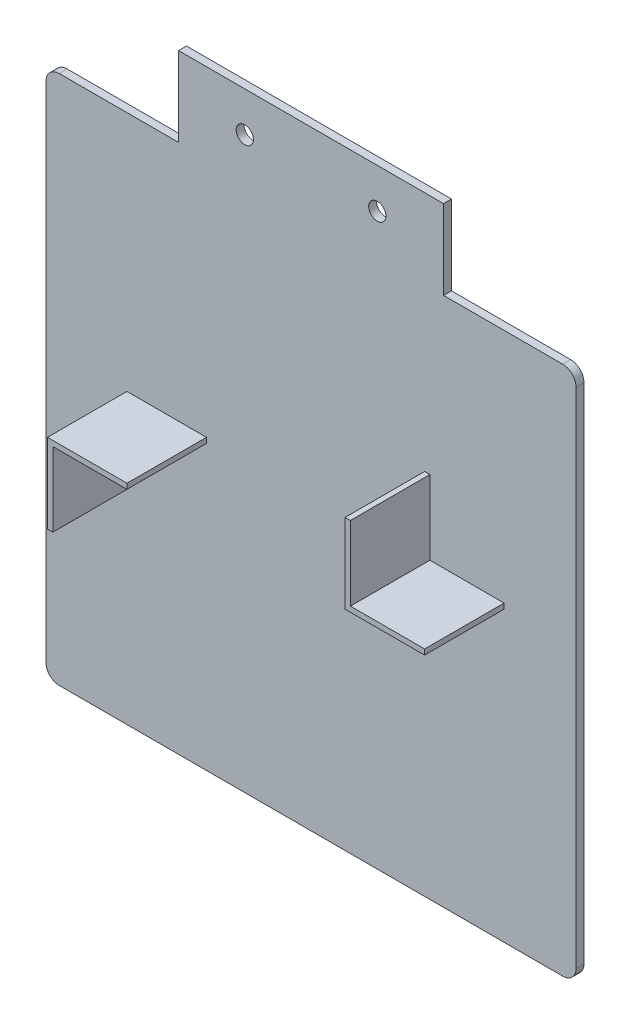
ISO-10303-21;
HEADER;
FILE_DESCRIPTION(('STEP AP214'),'2;1');
FILE_NAME('part.step','',(''),(''),'','','');
FILE_SCHEMA(('AUTOMOTIVE_DESIGN { 1 0 10303 214 1 1 1 1 }'));
ENDSEC;
DATA;
#1=APPLICATION_CONTEXT('core data for automotive mechanical design processes');
#2=APPLICATION_PROTOCOL_DEFINITION('international standard','automotive_design',2000,#1);
#3=PRODUCT_CONTEXT('',#1,'mechanical');
#4=PRODUCT('Part','Part','',(#3));
#5=PRODUCT_RELATED_PRODUCT_CATEGORY('part','',(#4));
#6=PRODUCT_DEFINITION_FORMATION('','',#4);
#7=PRODUCT_DEFINITION_CONTEXT('part definition',#1,'design');
#8=PRODUCT_DEFINITION('design','',#6,#7);
#9=PRODUCT_DEFINITION_SHAPE('','',#8);
#10=(LENGTH_UNIT() NAMED_UNIT(*) SI_UNIT(.MILLI.,.METRE.));
#11=(NAMED_UNIT(*) PLANE_ANGLE_UNIT() SI_UNIT($,.RADIAN.));
#12=(NAMED_UNIT(*) SI_UNIT($,.STERADIAN.) SOLID_ANGLE_UNIT());
#13=UNCERTAINTY_MEASURE_WITH_UNIT(LENGTH_MEASURE(1.E-05),#10,'distance_accuracy_value','');
#14=(GEOMETRIC_REPRESENTATION_CONTEXT(3) GLOBAL_UNCERTAINTY_ASSIGNED_CONTEXT((#13)) GLOBAL_UNIT_ASSIGNED_CONTEXT((#10,
#11,#12)) REPRESENTATION_CONTEXT('',''));
#15=CARTESIAN_POINT('',(0.,0.,0.));
#16=DIRECTION('',(0.,0.,1.));
#17=DIRECTION('',(1.,0.,0.));
#18=AXIS2_PLACEMENT_3D('',#15,#16,#17);
#19=CARTESIAN_POINT('',(-124.91452991453,37.2649572649573,0.));
#20=DIRECTION('',(0.,0.,-1.));
#21=DIRECTION('',(-1.,0.,0.));
#22=AXIS2_PLACEMENT_3D('',#19,#20,#21);
#23=PLANE('',#22);
#24=DIRECTION('',(0.,1.,0.));
#25=VECTOR('',#24,1.);
#26=CARTESIAN_POINT('',(42.9455751494544,-46.8579148870407,0.));
#27=LINE('',#26,#25);
#28=CARTESIAN_POINT('',(42.9455751494544,-48.8579148870407,0.));
#29=VERTEX_POINT('',#28);
#30=CARTESIAN_POINT('',(42.9455751494543,-46.8579148870407,0.));
#31=VERTEX_POINT('',#30);
#32=EDGE_CURVE('E224',#29,#31,#27,.T.);
#33=ORIENTED_EDGE('',*,*,#32,.F.);
#34=DIRECTION('',(1.,0.,0.));
#35=VECTOR('',#34,1.);
#36=CARTESIAN_POINT('',(42.9455751494544,-48.8579148870407,0.));
#37=LINE('',#36,#35);
#38=CARTESIAN_POINT('',(12.9455751494544,-48.8579148870407,0.));
#39=VERTEX_POINT('',#38);
#40=EDGE_CURVE('E237',#39,#29,#37,.T.);
#41=ORIENTED_EDGE('',*,*,#40,.F.);
#42=DIRECTION('',(0.,-1.,0.));
#43=VECTOR('',#42,1.);
#44=CARTESIAN_POINT('',(12.9455751494544,-48.8579148870407,0.));
#45=LINE('',#44,#43);
#46=CARTESIAN_POINT('',(12.9455751494544,-18.8579148870407,0.));
#47=VERTEX_POINT('',#46);
#48=EDGE_CURVE('E256',#47,#39,#45,.T.);
#49=ORIENTED_EDGE('',*,*,#48,.F.);
#50=DIRECTION('',(-1.,0.,0.));
#51=VECTOR('',#50,1.);
#52=CARTESIAN_POINT('',(14.9455751494544,-18.8579148870407,0.));
#53=LINE('',#52,#51);
#54=CARTESIAN_POINT('',(14.9455751494544,-18.8579148870407,0.));
#55=VERTEX_POINT('',#54);
#56=EDGE_CURVE('E253',#55,#47,#53,.T.);
#57=ORIENTED_EDGE('',*,*,#56,.F.);
#58=DIRECTION('',(0.,1.,0.));
#59=VECTOR('',#58,1.);
#60=CARTESIAN_POINT('',(14.9455751494544,-46.8579148870407,0.));
#61=LINE('',#60,#59);
#62=CARTESIAN_POINT('',(14.9455751494544,-46.8579148870407,0.));
#63=VERTEX_POINT('',#62);
#64=EDGE_CURVE('E250',#63,#55,#61,.T.);
#65=ORIENTED_EDGE('',*,*,#64,.F.);
#66=DIRECTION('',(-1.,0.,0.));
#67=VECTOR('',#66,1.);
#68=CARTESIAN_POINT('',(42.9455751494544,-46.8579148870407,0.));
#69=LINE('',#68,#67);
#70=EDGE_CURVE('E227',#31,#63,#69,.T.);
#71=ORIENTED_EDGE('',*,*,#70,.F.);
#72=EDGE_LOOP('',(#33,#41,#49,#57,#65,#71));
#73=FACE_BOUND('',#72,.T.);
#74=CARTESIAN_POINT('',(-54.91452991453,57.2649572649573,0.));
#75=DIRECTION('',(0.,0.,1.));
#76=DIRECTION('',(1.,0.,0.));
#77=AXIS2_PLACEMENT_3D('',#74,#75,#76);
#78=CIRCLE('',#77,3.25);
#79=CARTESIAN_POINT('',(-51.66452991453,57.2649572649573,0.));
#80=VERTEX_POINT('',#79);
#81=EDGE_CURVE('E278',#80,#80,#78,.T.);
#82=ORIENTED_EDGE('',*,*,#81,.F.);
#83=EDGE_LOOP('',(#82));
#84=FACE_BOUND('',#83,.T.);
#85=CARTESIAN_POINT('',(-4.91452991452994,57.2649572649573,0.));
#86=DIRECTION('',(0.,0.,1.));
#87=DIRECTION('',(1.,0.,0.));
#88=AXIS2_PLACEMENT_3D('',#85,#86,#87);
#89=CIRCLE('',#88,3.25);
#90=CARTESIAN_POINT('',(-1.66452991452994,57.2649572649573,0.));
#91=VERTEX_POINT('',#90);
#92=EDGE_CURVE('E282',#91,#91,#89,.T.);
#93=ORIENTED_EDGE('',*,*,#92,.F.);
#94=EDGE_LOOP('',(#93));
#95=FACE_BOUND('',#94,.T.);
#96=DIRECTION('',(-1.,0.,0.));
#97=VECTOR('',#96,1.);
#98=CARTESIAN_POINT('',(20.0854700854701,72.2649572649573,0.));
#99=LINE('',#98,#97);
#100=CARTESIAN_POINT('',(20.0854700854701,72.2649572649573,0.));
#101=VERTEX_POINT('',#100);
#102=CARTESIAN_POINT('',(-79.91452991453,72.2649572649573,0.));
#103=VERTEX_POINT('',#102);
#104=EDGE_CURVE('E288',#101,#103,#99,.T.);
#105=ORIENTED_EDGE('',*,*,#104,.T.);
#106=DIRECTION('',(0.,-1.,0.));
#107=VECTOR('',#106,1.);
#108=CARTESIAN_POINT('',(-79.91452991453,72.2649572649573,0.));
#109=LINE('',#108,#107);
#110=CARTESIAN_POINT('',(-79.91452991453,42.2649572649573,0.));
#111=VERTEX_POINT('',#110);
#112=EDGE_CURVE('E330',#103,#111,#109,.T.);
#113=ORIENTED_EDGE('',*,*,#112,.T.);
#114=DIRECTION('',(-1.,0.,0.));
#115=VECTOR('',#114,1.);
#116=CARTESIAN_POINT('',(-79.91452991453,42.2649572649573,0.));
#117=LINE('',#116,#115);
#118=CARTESIAN_POINT('',(-124.91452991453,42.2649572649573,0.));
#119=VERTEX_POINT('',#118);
#120=EDGE_CURVE('E333',#111,#119,#117,.T.);
#121=ORIENTED_EDGE('',*,*,#120,.T.);
#122=CARTESIAN_POINT('',(-124.91452991453,37.2649572649573,0.));
#123=DIRECTION('',(0.,0.,1.));
#124=DIRECTION('',(-1.,0.,0.));
#125=AXIS2_PLACEMENT_3D('',#122,#123,#124);
#126=CIRCLE('',#125,5.);
#127=CARTESIAN_POINT('',(-129.91452991453,37.2649572649572,0.));
#128=VERTEX_POINT('',#127);
#129=EDGE_CURVE('E336',#119,#128,#126,.T.);
#130=ORIENTED_EDGE('',*,*,#129,.T.);
#131=DIRECTION('',(0.,-1.,0.));
#132=VECTOR('',#131,1.);
#133=CARTESIAN_POINT('',(-129.91452991453,37.2649572649572,0.));
#134=LINE('',#133,#132);
#135=CARTESIAN_POINT('',(-129.91452991453,-152.735042735043,0.));
#136=VERTEX_POINT('',#135);
#137=EDGE_CURVE('E339',#128,#136,#134,.T.);
#138=ORIENTED_EDGE('',*,*,#137,.T.);
#139=CARTESIAN_POINT('',(-124.91452991453,-152.735042735043,0.));
#140=DIRECTION('',(0.,0.,1.));
#141=DIRECTION('',(-1.,0.,0.));
#142=AXIS2_PLACEMENT_3D('',#139,#140,#141);
#143=CIRCLE('',#142,5.);
#144=CARTESIAN_POINT('',(-124.91452991453,-157.735042735043,0.));
#145=VERTEX_POINT('',#144);
#146=EDGE_CURVE('E342',#136,#145,#143,.T.);
#147=ORIENTED_EDGE('',*,*,#146,.T.);
#148=DIRECTION('',(1.,0.,0.));
#149=VECTOR('',#148,1.);
#150=CARTESIAN_POINT('',(65.08547008547,-157.735042735043,0.));
#151=LINE('',#150,#149);
#152=CARTESIAN_POINT('',(65.08547008547,-157.735042735043,0.));
#153=VERTEX_POINT('',#152);
#154=EDGE_CURVE('E345',#145,#153,#151,.T.);
#155=ORIENTED_EDGE('',*,*,#154,.T.);
#156=CARTESIAN_POINT('',(65.08547008547,-152.735042735043,0.));
#157=DIRECTION('',(0.,0.,1.));
#158=DIRECTION('',(1.,0.,0.));
#159=AXIS2_PLACEMENT_3D('',#156,#157,#158);
#160=CIRCLE('',#159,5.);
#161=CARTESIAN_POINT('',(70.0854700854701,-152.735042735043,0.));
#162=VERTEX_POINT('',#161);
#163=EDGE_CURVE('E348',#153,#162,#160,.T.);
#164=ORIENTED_EDGE('',*,*,#163,.T.);
#165=DIRECTION('',(0.,1.,0.));
#166=VECTOR('',#165,1.);
#167=CARTESIAN_POINT('',(70.08547008547,37.2649572649573,0.));
#168=LINE('',#167,#166);
#169=CARTESIAN_POINT('',(70.08547008547,37.2649572649573,0.));
#170=VERTEX_POINT('',#169);
#171=EDGE_CURVE('E351',#162,#170,#168,.T.);
#172=ORIENTED_EDGE('',*,*,#171,.T.);
#173=CARTESIAN_POINT('',(65.08547008547,37.2649572649573,0.));
#174=DIRECTION('',(0.,0.,1.));
#175=DIRECTION('',(1.,0.,0.));
#176=AXIS2_PLACEMENT_3D('',#173,#174,#175);
#177=CIRCLE('',#176,5.);
#178=CARTESIAN_POINT('',(65.08547008547,42.2649572649573,0.));
#179=VERTEX_POINT('',#178);
#180=EDGE_CURVE('E354',#170,#179,#177,.T.);
#181=ORIENTED_EDGE('',*,*,#180,.T.);
#182=DIRECTION('',(-1.,0.,0.));
#183=VECTOR('',#182,1.);
#184=CARTESIAN_POINT('',(20.0854700854701,42.2649572649573,0.));
#185=LINE('',#184,#183);
#186=CARTESIAN_POINT('',(20.0854700854701,42.2649572649573,0.));
#187=VERTEX_POINT('',#186);
#188=EDGE_CURVE('E357',#179,#187,#185,.T.);
#189=ORIENTED_EDGE('',*,*,#188,.T.);
#190=DIRECTION('',(0.,1.,0.));
#191=VECTOR('',#190,1.);
#192=CARTESIAN_POINT('',(20.0854700854701,72.2649572649573,0.));
#193=LINE('',#192,#191);
#194=EDGE_CURVE('E295',#187,#101,#193,.T.);
#195=ORIENTED_EDGE('',*,*,#194,.T.);
#196=EDGE_LOOP('',(#105,#113,#121,#130,#138,#147,#155,#164,#172,#181,#189,#195));
#197=FACE_BOUND('',#196,.T.);
#198=DIRECTION('',(0.,1.,0.));
#199=VECTOR('',#198,1.);
#200=CARTESIAN_POINT('',(-69.3774588113321,-50.8579148870407,0.));
#201=LINE('',#200,#199);
#202=CARTESIAN_POINT('',(-69.3774588113321,-50.8579148870407,0.));
#203=VERTEX_POINT('',#202);
#204=CARTESIAN_POINT('',(-69.3774588113321,-48.8579148870407,0.));
#205=VERTEX_POINT('',#204);
#206=EDGE_CURVE('E223',#203,#205,#201,.T.);
#207=ORIENTED_EDGE('',*,*,#206,.F.);
#208=DIRECTION('',(1.,0.,0.));
#209=VECTOR('',#208,1.);
#210=CARTESIAN_POINT('',(-69.3774588113321,-50.8579148870407,0.));
#211=LINE('',#210,#209);
#212=CARTESIAN_POINT('',(-97.3774588113321,-50.8579148870407,0.));
#213=VERTEX_POINT('',#212);
#214=EDGE_CURVE('E220',#213,#203,#211,.T.);
#215=ORIENTED_EDGE('',*,*,#214,.F.);
#216=DIRECTION('',(0.,1.,0.));
#217=VECTOR('',#216,1.);
#218=CARTESIAN_POINT('',(-97.3774588113321,-50.8579148870407,0.));
#219=LINE('',#218,#217);
#220=CARTESIAN_POINT('',(-97.3774588113321,-78.8579148870407,0.));
#221=VERTEX_POINT('',#220);
#222=EDGE_CURVE('E734',#221,#213,#219,.T.);
#223=ORIENTED_EDGE('',*,*,#222,.F.);
#224=DIRECTION('',(1.,0.,0.));
#225=VECTOR('',#224,1.);
#226=CARTESIAN_POINT('',(-97.3774588113321,-78.8579148870407,0.));
#227=LINE('',#226,#225);
#228=CARTESIAN_POINT('',(-99.3774588113321,-78.8579148870407,0.));
#229=VERTEX_POINT('',#228);
#230=EDGE_CURVE('E749',#229,#221,#227,.T.);
#231=ORIENTED_EDGE('',*,*,#230,.F.);
#232=DIRECTION('',(0.,-1.,0.));
#233=VECTOR('',#232,1.);
#234=CARTESIAN_POINT('',(-99.3774588113321,-48.8579148870407,0.));
#235=LINE('',#234,#233);
#236=CARTESIAN_POINT('',(-99.3774588113321,-48.8579148870407,0.));
#237=VERTEX_POINT('',#236);
#238=EDGE_CURVE('E63',#237,#229,#235,.T.);
#239=ORIENTED_EDGE('',*,*,#238,.F.);
#240=DIRECTION('',(-1.,0.,0.));
#241=VECTOR('',#240,1.);
#242=CARTESIAN_POINT('',(-69.3774588113321,-48.8579148870407,0.));
#243=LINE('',#242,#241);
#244=EDGE_CURVE('E58',#205,#237,#243,.T.);
#245=ORIENTED_EDGE('',*,*,#244,.F.);
#246=EDGE_LOOP('',(#207,#215,#223,#231,#239,#245));
#247=FACE_BOUND('',#246,.T.);
#248=ADVANCED_FACE('F41',(#73,#84,#95,#197,#247),#23,.F.);
#249=CARTESIAN_POINT('',(20.0854700854701,72.2649572649573,-3.));
#250=DIRECTION('',(0.,1.,0.));
#251=DIRECTION('',(-1.,0.,0.));
#252=AXIS2_PLACEMENT_3D('',#249,#250,#251);
#253=PLANE('',#252);
#254=ORIENTED_EDGE('',*,*,#104,.F.);
#255=DIRECTION('',(0.,0.,1.));
#256=VECTOR('',#255,1.);
#257=CARTESIAN_POINT('',(20.0854700854701,72.2649572649573,-3.));
#258=LINE('',#257,#256);
#259=CARTESIAN_POINT('',(20.0854700854701,72.2649572649573,-3.));
#260=VERTEX_POINT('',#259);
#261=EDGE_CURVE('E11',#260,#101,#258,.T.);
#262=ORIENTED_EDGE('',*,*,#261,.F.);
#263=DIRECTION('',(-1.,0.,0.));
#264=VECTOR('',#263,1.);
#265=CARTESIAN_POINT('',(20.0854700854701,72.2649572649573,-3.));
#266=LINE('',#265,#264);
#267=CARTESIAN_POINT('',(-79.91452991453,72.2649572649573,-3.));
#268=VERTEX_POINT('',#267);
#269=EDGE_CURVE('E291',#260,#268,#266,.T.);
#270=ORIENTED_EDGE('',*,*,#269,.T.);
#271=DIRECTION('',(0.,0.,1.));
#272=VECTOR('',#271,1.);
#273=CARTESIAN_POINT('',(-79.91452991453,72.2649572649573,-3.));
#274=LINE('',#273,#272);
#275=EDGE_CURVE('E45',#268,#103,#274,.T.);
#276=ORIENTED_EDGE('',*,*,#275,.T.);
#277=EDGE_LOOP('',(#254,#262,#270,#276));
#278=FACE_BOUND('',#277,.T.);
#279=ADVANCED_FACE('F43',(#278),#253,.T.);
#280=CARTESIAN_POINT('',(20.0854700854701,72.2649572649573,-3.));
#281=DIRECTION('',(1.,0.,0.));
#282=DIRECTION('',(0.,1.,0.));
#283=AXIS2_PLACEMENT_3D('',#280,#281,#282);
#284=PLANE('',#283);
#285=ORIENTED_EDGE('',*,*,#194,.F.);
#286=DIRECTION('',(0.,0.,1.));
#287=VECTOR('',#286,1.);
#288=CARTESIAN_POINT('',(20.0854700854701,42.2649572649573,-3.));
#289=LINE('',#288,#287);
#290=CARTESIAN_POINT('',(20.0854700854701,42.2649572649573,-3.));
#291=VERTEX_POINT('',#290);
#292=EDGE_CURVE('E50',#291,#187,#289,.T.);
#293=ORIENTED_EDGE('',*,*,#292,.F.);
#294=DIRECTION('',(0.,1.,0.));
#295=VECTOR('',#294,1.);
#296=CARTESIAN_POINT('',(20.0854700854701,72.2649572649573,-3.));
#297=LINE('',#296,#295);
#298=EDGE_CURVE('E325',#291,#260,#297,.T.);
#299=ORIENTED_EDGE('',*,*,#298,.T.);
#300=ORIENTED_EDGE('',*,*,#261,.T.);
#301=EDGE_LOOP('',(#285,#293,#299,#300));
#302=FACE_BOUND('',#301,.T.);
#303=ADVANCED_FACE('F391',(#302),#284,.T.);
#304=CARTESIAN_POINT('',(20.0854700854701,42.2649572649573,-3.));
#305=DIRECTION('',(0.,1.,0.));
#306=DIRECTION('',(0.,0.,1.));
#307=AXIS2_PLACEMENT_3D('',#304,#305,#306);
#308=PLANE('',#307);
#309=ORIENTED_EDGE('',*,*,#188,.F.);
#310=DIRECTION('',(0.,0.,1.));
#311=VECTOR('',#310,1.);
#312=CARTESIAN_POINT('',(65.08547008547,42.2649572649573,-3.));
#313=LINE('',#312,#311);
#314=CARTESIAN_POINT('',(65.08547008547,42.2649572649573,-3.));
#315=VERTEX_POINT('',#314);
#316=EDGE_CURVE('E363',#315,#179,#313,.T.);
#317=ORIENTED_EDGE('',*,*,#316,.F.);
#318=DIRECTION('',(-1.,0.,0.));
#319=VECTOR('',#318,1.);
#320=CARTESIAN_POINT('',(20.0854700854701,42.2649572649573,-3.));
#321=LINE('',#320,#319);
#322=EDGE_CURVE('E322',#315,#291,#321,.T.);
#323=ORIENTED_EDGE('',*,*,#322,.T.);
#324=ORIENTED_EDGE('',*,*,#292,.T.);
#325=EDGE_LOOP('',(#309,#317,#323,#324));
#326=FACE_BOUND('',#325,.T.);
#327=ADVANCED_FACE('F428',(#326),#308,.T.);
#328=CARTESIAN_POINT('',(65.08547008547,37.2649572649573,-3.));
#329=DIRECTION('',(0.,0.,1.));
#330=DIRECTION('',(1.,0.,0.));
#331=AXIS2_PLACEMENT_3D('',#328,#329,#330);
#332=CYLINDRICAL_SURFACE('',#331,5.);
#333=ORIENTED_EDGE('',*,*,#180,.F.);
#334=DIRECTION('',(0.,0.,1.));
#335=VECTOR('',#334,1.);
#336=CARTESIAN_POINT('',(70.08547008547,37.2649572649573,-3.));
#337=LINE('',#336,#335);
#338=CARTESIAN_POINT('',(70.08547008547,37.2649572649573,-3.));
#339=VERTEX_POINT('',#338);
#340=EDGE_CURVE('E365',#339,#170,#337,.T.);
#341=ORIENTED_EDGE('',*,*,#340,.F.);
#342=CARTESIAN_POINT('',(65.08547008547,37.2649572649573,-3.));
#343=DIRECTION('',(0.,0.,1.));
#344=DIRECTION('',(1.,0.,0.));
#345=AXIS2_PLACEMENT_3D('',#342,#343,#344);
#346=CIRCLE('',#345,5.);
#347=EDGE_CURVE('E319',#339,#315,#346,.T.);
#348=ORIENTED_EDGE('',*,*,#347,.T.);
#349=ORIENTED_EDGE('',*,*,#316,.T.);
#350=EDGE_LOOP('',(#333,#341,#348,#349));
#351=FACE_BOUND('',#350,.T.);
#352=ADVANCED_FACE('F425',(#351),#332,.T.);
#353=CARTESIAN_POINT('',(70.08547008547,37.2649572649573,-3.));
#354=DIRECTION('',(1.,0.,0.));
#355=DIRECTION('',(0.,1.,0.));
#356=AXIS2_PLACEMENT_3D('',#353,#354,#355);
#357=PLANE('',#356);
#358=ORIENTED_EDGE('',*,*,#171,.F.);
#359=DIRECTION('',(0.,0.,1.));
#360=VECTOR('',#359,1.);
#361=CARTESIAN_POINT('',(70.0854700854701,-152.735042735043,-3.));
#362=LINE('',#361,#360);
#363=CARTESIAN_POINT('',(70.0854700854701,-152.735042735043,-3.));
#364=VERTEX_POINT('',#363);
#365=EDGE_CURVE('E367',#364,#162,#362,.T.);
#366=ORIENTED_EDGE('',*,*,#365,.F.);
#367=DIRECTION('',(0.,1.,0.));
#368=VECTOR('',#367,1.);
#369=CARTESIAN_POINT('',(70.08547008547,37.2649572649573,-3.));
#370=LINE('',#369,#368);
#371=EDGE_CURVE('E316',#364,#339,#370,.T.);
#372=ORIENTED_EDGE('',*,*,#371,.T.);
#373=ORIENTED_EDGE('',*,*,#340,.T.);
#374=EDGE_LOOP('',(#358,#366,#372,#373));
#375=FACE_BOUND('',#374,.T.);
#376=ADVANCED_FACE('F422',(#375),#357,.T.);
#377=CARTESIAN_POINT('',(65.08547008547,-152.735042735043,-3.));
#378=DIRECTION('',(0.,0.,1.));
#379=DIRECTION('',(1.,0.,0.));
#380=AXIS2_PLACEMENT_3D('',#377,#378,#379);
#381=CYLINDRICAL_SURFACE('',#380,5.);
#382=ORIENTED_EDGE('',*,*,#163,.F.);
#383=DIRECTION('',(0.,0.,1.));
#384=VECTOR('',#383,1.);
#385=CARTESIAN_POINT('',(65.08547008547,-157.735042735043,-3.));
#386=LINE('',#385,#384);
#387=CARTESIAN_POINT('',(65.08547008547,-157.735042735043,-3.));
#388=VERTEX_POINT('',#387);
#389=EDGE_CURVE('E369',#388,#153,#386,.T.);
#390=ORIENTED_EDGE('',*,*,#389,.F.);
#391=CARTESIAN_POINT('',(65.08547008547,-152.735042735043,-3.));
#392=DIRECTION('',(0.,0.,1.));
#393=DIRECTION('',(1.,0.,0.));
#394=AXIS2_PLACEMENT_3D('',#391,#392,#393);
#395=CIRCLE('',#394,5.);
#396=EDGE_CURVE('E313',#388,#364,#395,.T.);
#397=ORIENTED_EDGE('',*,*,#396,.T.);
#398=ORIENTED_EDGE('',*,*,#365,.T.);
#399=EDGE_LOOP('',(#382,#390,#397,#398));
#400=FACE_BOUND('',#399,.T.);
#401=ADVANCED_FACE('F418',(#400),#381,.T.);
#402=CARTESIAN_POINT('',(65.08547008547,-157.735042735043,-3.));
#403=DIRECTION('',(0.,-1.,0.));
#404=DIRECTION('',(1.,0.,0.));
#405=AXIS2_PLACEMENT_3D('',#402,#403,#404);
#406=PLANE('',#405);
#407=ORIENTED_EDGE('',*,*,#154,.F.);
#408=DIRECTION('',(0.,0.,1.));
#409=VECTOR('',#408,1.);
#410=CARTESIAN_POINT('',(-124.91452991453,-157.735042735043,-3.));
#411=LINE('',#410,#409);
#412=CARTESIAN_POINT('',(-124.91452991453,-157.735042735043,-3.));
#413=VERTEX_POINT('',#412);
#414=EDGE_CURVE('E371',#413,#145,#411,.T.);
#415=ORIENTED_EDGE('',*,*,#414,.F.);
#416=DIRECTION('',(1.,0.,0.));
#417=VECTOR('',#416,1.);
#418=CARTESIAN_POINT('',(65.08547008547,-157.735042735043,-3.));
#419=LINE('',#418,#417);
#420=EDGE_CURVE('E310',#413,#388,#419,.T.);
#421=ORIENTED_EDGE('',*,*,#420,.T.);
#422=ORIENTED_EDGE('',*,*,#389,.T.);
#423=EDGE_LOOP('',(#407,#415,#421,#422));
#424=FACE_BOUND('',#423,.T.);
#425=ADVANCED_FACE('F414',(#424),#406,.T.);
#426=CARTESIAN_POINT('',(-124.91452991453,-152.735042735043,-3.));
#427=DIRECTION('',(0.,0.,1.));
#428=DIRECTION('',(1.,0.,0.));
#429=AXIS2_PLACEMENT_3D('',#426,#427,#428);
#430=CYLINDRICAL_SURFACE('',#429,5.);
#431=ORIENTED_EDGE('',*,*,#146,.F.);
#432=DIRECTION('',(0.,0.,1.));
#433=VECTOR('',#432,1.);
#434=CARTESIAN_POINT('',(-129.91452991453,-152.735042735043,-3.));
#435=LINE('',#434,#433);
#436=CARTESIAN_POINT('',(-129.91452991453,-152.735042735043,-3.));
#437=VERTEX_POINT('',#436);
#438=EDGE_CURVE('E373',#437,#136,#435,.T.);
#439=ORIENTED_EDGE('',*,*,#438,.F.);
#440=CARTESIAN_POINT('',(-124.91452991453,-152.735042735043,-3.));
#441=DIRECTION('',(0.,0.,1.));
#442=DIRECTION('',(-1.,0.,0.));
#443=AXIS2_PLACEMENT_3D('',#440,#441,#442);
#444=CIRCLE('',#443,5.);
#445=EDGE_CURVE('E307',#437,#413,#444,.T.);
#446=ORIENTED_EDGE('',*,*,#445,.T.);
#447=ORIENTED_EDGE('',*,*,#414,.T.);
#448=EDGE_LOOP('',(#431,#439,#446,#447));
#449=FACE_BOUND('',#448,.T.);
#450=ADVANCED_FACE('F410',(#449),#430,.T.);
#451=CARTESIAN_POINT('',(-129.91452991453,37.2649572649572,-3.));
#452=DIRECTION('',(-1.,0.,0.));
#453=DIRECTION('',(0.,-1.,0.));
#454=AXIS2_PLACEMENT_3D('',#451,#452,#453);
#455=PLANE('',#454);
#456=ORIENTED_EDGE('',*,*,#137,.F.);
#457=DIRECTION('',(0.,0.,1.));
#458=VECTOR('',#457,1.);
#459=CARTESIAN_POINT('',(-129.91452991453,37.2649572649572,-3.));
#460=LINE('',#459,#458);
#461=CARTESIAN_POINT('',(-129.91452991453,37.2649572649572,-3.));
#462=VERTEX_POINT('',#461);
#463=EDGE_CURVE('E375',#462,#128,#460,.T.);
#464=ORIENTED_EDGE('',*,*,#463,.F.);
#465=DIRECTION('',(0.,-1.,0.));
#466=VECTOR('',#465,1.);
#467=CARTESIAN_POINT('',(-129.91452991453,37.2649572649572,-3.));
#468=LINE('',#467,#466);
#469=EDGE_CURVE('E304',#462,#437,#468,.T.);
#470=ORIENTED_EDGE('',*,*,#469,.T.);
#471=ORIENTED_EDGE('',*,*,#438,.T.);
#472=EDGE_LOOP('',(#456,#464,#470,#471));
#473=FACE_BOUND('',#472,.T.);
#474=ADVANCED_FACE('F406',(#473),#455,.T.);
#475=CARTESIAN_POINT('',(-124.91452991453,37.2649572649573,-3.));
#476=DIRECTION('',(0.,0.,1.));
#477=DIRECTION('',(1.,0.,0.));
#478=AXIS2_PLACEMENT_3D('',#475,#476,#477);
#479=CYLINDRICAL_SURFACE('',#478,5.);
#480=ORIENTED_EDGE('',*,*,#129,.F.);
#481=DIRECTION('',(0.,0.,1.));
#482=VECTOR('',#481,1.);
#483=CARTESIAN_POINT('',(-124.91452991453,42.2649572649573,-3.));
#484=LINE('',#483,#482);
#485=CARTESIAN_POINT('',(-124.91452991453,42.2649572649573,-3.));
#486=VERTEX_POINT('',#485);
#487=EDGE_CURVE('E377',#486,#119,#484,.T.);
#488=ORIENTED_EDGE('',*,*,#487,.F.);
#489=CARTESIAN_POINT('',(-124.91452991453,37.2649572649573,-3.));
#490=DIRECTION('',(0.,0.,1.));
#491=DIRECTION('',(-1.,0.,0.));
#492=AXIS2_PLACEMENT_3D('',#489,#490,#491);
#493=CIRCLE('',#492,5.);
#494=EDGE_CURVE('E301',#486,#462,#493,.T.);
#495=ORIENTED_EDGE('',*,*,#494,.T.);
#496=ORIENTED_EDGE('',*,*,#463,.T.);
#497=EDGE_LOOP('',(#480,#488,#495,#496));
#498=FACE_BOUND('',#497,.T.);
#499=ADVANCED_FACE('F404',(#498),#479,.T.);
#500=CARTESIAN_POINT('',(-79.91452991453,42.2649572649573,-3.));
#501=DIRECTION('',(0.,1.,0.));
#502=DIRECTION('',(-1.,0.,0.));
#503=AXIS2_PLACEMENT_3D('',#500,#501,#502);
#504=PLANE('',#503);
#505=ORIENTED_EDGE('',*,*,#120,.F.);
#506=DIRECTION('',(0.,0.,1.));
#507=VECTOR('',#506,1.);
#508=CARTESIAN_POINT('',(-79.91452991453,42.2649572649573,-3.));
#509=LINE('',#508,#507);
#510=CARTESIAN_POINT('',(-79.91452991453,42.2649572649573,-3.));
#511=VERTEX_POINT('',#510);
#512=EDGE_CURVE('E378',#511,#111,#509,.T.);
#513=ORIENTED_EDGE('',*,*,#512,.F.);
#514=DIRECTION('',(-1.,0.,0.));
#515=VECTOR('',#514,1.);
#516=CARTESIAN_POINT('',(-79.91452991453,42.2649572649573,-3.));
#517=LINE('',#516,#515);
#518=EDGE_CURVE('E298',#511,#486,#517,.T.);
#519=ORIENTED_EDGE('',*,*,#518,.T.);
#520=ORIENTED_EDGE('',*,*,#487,.T.);
#521=EDGE_LOOP('',(#505,#513,#519,#520));
#522=FACE_BOUND('',#521,.T.);
#523=ADVANCED_FACE('F400',(#522),#504,.T.);
#524=CARTESIAN_POINT('',(-79.91452991453,72.2649572649573,-3.));
#525=DIRECTION('',(-1.,0.,0.));
#526=DIRECTION('',(0.,0.,1.));
#527=AXIS2_PLACEMENT_3D('',#524,#525,#526);
#528=PLANE('',#527);
#529=ORIENTED_EDGE('',*,*,#112,.F.);
#530=ORIENTED_EDGE('',*,*,#275,.F.);
#531=DIRECTION('',(0.,-1.,0.));
#532=VECTOR('',#531,1.);
#533=CARTESIAN_POINT('',(-79.91452991453,72.2649572649573,-3.));
#534=LINE('',#533,#532);
#535=EDGE_CURVE('E294',#268,#511,#534,.T.);
#536=ORIENTED_EDGE('',*,*,#535,.T.);
#537=ORIENTED_EDGE('',*,*,#512,.T.);
#538=EDGE_LOOP('',(#529,#530,#536,#537));
#539=FACE_BOUND('',#538,.T.);
#540=ADVANCED_FACE('F386',(#539),#528,.T.);
#541=CARTESIAN_POINT('',(-124.91452991453,37.2649572649573,-3.));
#542=DIRECTION('',(0.,0.,-1.));
#543=DIRECTION('',(-1.,0.,0.));
#544=AXIS2_PLACEMENT_3D('',#541,#542,#543);
#545=PLANE('',#544);
#546=CARTESIAN_POINT('',(-54.91452991453,57.2649572649573,-3.));
#547=DIRECTION('',(0.,0.,1.));
#548=DIRECTION('',(1.,0.,0.));
#549=AXIS2_PLACEMENT_3D('',#546,#547,#548);
#550=CIRCLE('',#549,3.25);
#551=CARTESIAN_POINT('',(-51.66452991453,57.2649572649573,-3.));
#552=VERTEX_POINT('',#551);
#553=EDGE_CURVE('E279',#552,#552,#550,.T.);
#554=ORIENTED_EDGE('',*,*,#553,.T.);
#555=EDGE_LOOP('',(#554));
#556=FACE_BOUND('',#555,.T.);
#557=CARTESIAN_POINT('',(-4.91452991452994,57.2649572649573,-3.));
#558=DIRECTION('',(0.,0.,1.));
#559=DIRECTION('',(1.,0.,0.));
#560=AXIS2_PLACEMENT_3D('',#557,#558,#559);
#561=CIRCLE('',#560,3.25);
#562=CARTESIAN_POINT('',(-1.66452991452994,57.2649572649573,-3.));
#563=VERTEX_POINT('',#562);
#564=EDGE_CURVE('E285',#563,#563,#561,.T.);
#565=ORIENTED_EDGE('',*,*,#564,.T.);
#566=EDGE_LOOP('',(#565));
#567=FACE_BOUND('',#566,.T.);
#568=ORIENTED_EDGE('',*,*,#269,.F.);
#569=ORIENTED_EDGE('',*,*,#298,.F.);
#570=ORIENTED_EDGE('',*,*,#322,.F.);
#571=ORIENTED_EDGE('',*,*,#347,.F.);
#572=ORIENTED_EDGE('',*,*,#371,.F.);
#573=ORIENTED_EDGE('',*,*,#396,.F.);
#574=ORIENTED_EDGE('',*,*,#420,.F.);
#575=ORIENTED_EDGE('',*,*,#445,.F.);
#576=ORIENTED_EDGE('',*,*,#469,.F.);
#577=ORIENTED_EDGE('',*,*,#494,.F.);
#578=ORIENTED_EDGE('',*,*,#518,.F.);
#579=ORIENTED_EDGE('',*,*,#535,.F.);
#580=EDGE_LOOP('',(#568,#569,#570,#571,#572,#573,#574,#575,#576,#577,#578,#579));
#581=FACE_BOUND('',#580,.T.);
#582=ADVANCED_FACE('F394',(#556,#567,#581),#545,.T.);
#583=CARTESIAN_POINT('',(-4.91452991452994,57.2649572649573,-3.));
#584=DIRECTION('',(0.,0.,1.));
#585=DIRECTION('',(1.,0.,0.));
#586=AXIS2_PLACEMENT_3D('',#583,#584,#585);
#587=CYLINDRICAL_SURFACE('',#586,3.25);
#588=ORIENTED_EDGE('',*,*,#564,.F.);
#589=EDGE_LOOP('',(#588));
#590=FACE_BOUND('',#589,.T.);
#591=ORIENTED_EDGE('',*,*,#92,.T.);
#592=EDGE_LOOP('',(#591));
#593=FACE_BOUND('',#592,.T.);
#594=ADVANCED_FACE('F449',(#590,#593),#587,.F.);
#595=CARTESIAN_POINT('',(-54.91452991453,57.2649572649573,-3.));
#596=DIRECTION('',(0.,0.,1.));
#597=DIRECTION('',(1.,0.,0.));
#598=AXIS2_PLACEMENT_3D('',#595,#596,#597);
#599=CYLINDRICAL_SURFACE('',#598,3.25);
#600=ORIENTED_EDGE('',*,*,#553,.F.);
#601=EDGE_LOOP('',(#600));
#602=FACE_BOUND('',#601,.T.);
#603=ORIENTED_EDGE('',*,*,#81,.T.);
#604=EDGE_LOOP('',(#603));
#605=FACE_BOUND('',#604,.T.);
#606=ADVANCED_FACE('F453',(#602,#605),#599,.F.);
#607=CARTESIAN_POINT('',(42.9455751494544,-46.8579148870407,30.));
#608=DIRECTION('',(-1.,0.,0.));
#609=DIRECTION('',(0.,0.,1.));
#610=AXIS2_PLACEMENT_3D('',#607,#608,#609);
#611=PLANE('',#610);
#612=ORIENTED_EDGE('',*,*,#32,.T.);
#613=DIRECTION('',(0.,0.,-1.));
#614=VECTOR('',#613,1.);
#615=CARTESIAN_POINT('',(42.9455751494544,-46.8579148870407,30.));
#616=LINE('',#615,#614);
#617=CARTESIAN_POINT('',(42.9455751494544,-46.8579148870407,30.));
#618=VERTEX_POINT('',#617);
#619=EDGE_CURVE('E275',#618,#31,#616,.T.);
#620=ORIENTED_EDGE('',*,*,#619,.F.);
#621=DIRECTION('',(0.,1.,0.));
#622=VECTOR('',#621,1.);
#623=CARTESIAN_POINT('',(42.9455751494544,-46.8579148870407,30.));
#624=LINE('',#623,#622);
#625=CARTESIAN_POINT('',(42.9455751494544,-48.8579148870407,30.));
#626=VERTEX_POINT('',#625);
#627=EDGE_CURVE('E233',#626,#618,#624,.T.);
#628=ORIENTED_EDGE('',*,*,#627,.F.);
#629=DIRECTION('',(0.,0.,-1.));
#630=VECTOR('',#629,1.);
#631=CARTESIAN_POINT('',(42.9455751494544,-48.8579148870407,30.));
#632=LINE('',#631,#630);
#633=EDGE_CURVE('E246',#626,#29,#632,.T.);
#634=ORIENTED_EDGE('',*,*,#633,.T.);
#635=EDGE_LOOP('',(#612,#620,#628,#634));
#636=FACE_BOUND('',#635,.T.);
#637=ADVANCED_FACE('F457',(#636),#611,.F.);
#638=CARTESIAN_POINT('',(42.9455751494544,-46.8579148870407,30.));
#639=DIRECTION('',(0.,-1.,0.));
#640=DIRECTION('',(0.,0.,-1.));
#641=AXIS2_PLACEMENT_3D('',#638,#639,#640);
#642=PLANE('',#641);
#643=ORIENTED_EDGE('',*,*,#70,.T.);
#644=DIRECTION('',(0.,0.,-1.));
#645=VECTOR('',#644,1.);
#646=CARTESIAN_POINT('',(14.9455751494544,-46.8579148870407,30.));
#647=LINE('',#646,#645);
#648=CARTESIAN_POINT('',(14.9455751494544,-46.8579148870407,30.));
#649=VERTEX_POINT('',#648);
#650=EDGE_CURVE('E272',#649,#63,#647,.T.);
#651=ORIENTED_EDGE('',*,*,#650,.F.);
#652=DIRECTION('',(-1.,0.,0.));
#653=VECTOR('',#652,1.);
#654=CARTESIAN_POINT('',(42.9455751494544,-46.8579148870407,30.));
#655=LINE('',#654,#653);
#656=EDGE_CURVE('E236',#618,#649,#655,.T.);
#657=ORIENTED_EDGE('',*,*,#656,.F.);
#658=ORIENTED_EDGE('',*,*,#619,.T.);
#659=EDGE_LOOP('',(#643,#651,#657,#658));
#660=FACE_BOUND('',#659,.T.);
#661=ADVANCED_FACE('F461',(#660),#642,.F.);
#662=CARTESIAN_POINT('',(14.9455751494544,-46.8579148870407,30.));
#663=DIRECTION('',(-1.,0.,0.));
#664=DIRECTION('',(0.,0.,1.));
#665=AXIS2_PLACEMENT_3D('',#662,#663,#664);
#666=PLANE('',#665);
#667=ORIENTED_EDGE('',*,*,#64,.T.);
#668=DIRECTION('',(0.,0.,-1.));
#669=VECTOR('',#668,1.);
#670=CARTESIAN_POINT('',(14.9455751494544,-18.8579148870407,30.));
#671=LINE('',#670,#669);
#672=CARTESIAN_POINT('',(14.9455751494544,-18.8579148870407,30.));
#673=VERTEX_POINT('',#672);
#674=EDGE_CURVE('E269',#673,#55,#671,.T.);
#675=ORIENTED_EDGE('',*,*,#674,.F.);
#676=DIRECTION('',(0.,1.,0.));
#677=VECTOR('',#676,1.);
#678=CARTESIAN_POINT('',(14.9455751494544,-46.8579148870407,30.));
#679=LINE('',#678,#677);
#680=EDGE_CURVE('E239',#649,#673,#679,.T.);
#681=ORIENTED_EDGE('',*,*,#680,.F.);
#682=ORIENTED_EDGE('',*,*,#650,.T.);
#683=EDGE_LOOP('',(#667,#675,#681,#682));
#684=FACE_BOUND('',#683,.T.);
#685=ADVANCED_FACE('F465',(#684),#666,.F.);
#686=CARTESIAN_POINT('',(14.9455751494544,-18.8579148870407,30.));
#687=DIRECTION('',(0.,-1.,0.));
#688=DIRECTION('',(0.,0.,-1.));
#689=AXIS2_PLACEMENT_3D('',#686,#687,#688);
#690=PLANE('',#689);
#691=ORIENTED_EDGE('',*,*,#56,.T.);
#692=DIRECTION('',(0.,0.,-1.));
#693=VECTOR('',#692,1.);
#694=CARTESIAN_POINT('',(12.9455751494544,-18.8579148870407,30.));
#695=LINE('',#694,#693);
#696=CARTESIAN_POINT('',(12.9455751494544,-18.8579148870407,30.));
#697=VERTEX_POINT('',#696);
#698=EDGE_CURVE('E266',#697,#47,#695,.T.);
#699=ORIENTED_EDGE('',*,*,#698,.F.);
#700=DIRECTION('',(-1.,0.,0.));
#701=VECTOR('',#700,1.);
#702=CARTESIAN_POINT('',(14.9455751494544,-18.8579148870407,30.));
#703=LINE('',#702,#701);
#704=EDGE_CURVE('E241',#673,#697,#703,.T.);
#705=ORIENTED_EDGE('',*,*,#704,.F.);
#706=ORIENTED_EDGE('',*,*,#674,.T.);
#707=EDGE_LOOP('',(#691,#699,#705,#706));
#708=FACE_BOUND('',#707,.T.);
#709=ADVANCED_FACE('F469',(#708),#690,.F.);
#710=CARTESIAN_POINT('',(12.9455751494544,-48.8579148870407,30.));
#711=DIRECTION('',(1.,0.,0.));
#712=DIRECTION('',(0.,0.,-1.));
#713=AXIS2_PLACEMENT_3D('',#710,#711,#712);
#714=PLANE('',#713);
#715=ORIENTED_EDGE('',*,*,#48,.T.);
#716=DIRECTION('',(0.,0.,-1.));
#717=VECTOR('',#716,1.);
#718=CARTESIAN_POINT('',(12.9455751494544,-48.8579148870407,30.));
#719=LINE('',#718,#717);
#720=CARTESIAN_POINT('',(12.9455751494544,-48.8579148870407,30.));
#721=VERTEX_POINT('',#720);
#722=EDGE_CURVE('E263',#721,#39,#719,.T.);
#723=ORIENTED_EDGE('',*,*,#722,.F.);
#724=DIRECTION('',(0.,-1.,0.));
#725=VECTOR('',#724,1.);
#726=CARTESIAN_POINT('',(12.9455751494544,-48.8579148870407,30.));
#727=LINE('',#726,#725);
#728=EDGE_CURVE('E243',#697,#721,#727,.T.);
#729=ORIENTED_EDGE('',*,*,#728,.F.);
#730=ORIENTED_EDGE('',*,*,#698,.T.);
#731=EDGE_LOOP('',(#715,#723,#729,#730));
#732=FACE_BOUND('',#731,.T.);
#733=ADVANCED_FACE('F473',(#732),#714,.F.);
#734=CARTESIAN_POINT('',(42.9455751494544,-48.8579148870407,30.));
#735=DIRECTION('',(0.,1.,0.));
#736=DIRECTION('',(-1.,0.,0.));
#737=AXIS2_PLACEMENT_3D('',#734,#735,#736);
#738=PLANE('',#737);
#739=ORIENTED_EDGE('',*,*,#40,.T.);
#740=ORIENTED_EDGE('',*,*,#633,.F.);
#741=DIRECTION('',(1.,0.,0.));
#742=VECTOR('',#741,1.);
#743=CARTESIAN_POINT('',(42.9455751494544,-48.8579148870407,30.));
#744=LINE('',#743,#742);
#745=EDGE_CURVE('E245',#721,#626,#744,.T.);
#746=ORIENTED_EDGE('',*,*,#745,.F.);
#747=ORIENTED_EDGE('',*,*,#722,.T.);
#748=EDGE_LOOP('',(#739,#740,#746,#747));
#749=FACE_BOUND('',#748,.T.);
#750=ADVANCED_FACE('F477',(#749),#738,.F.);
#751=CARTESIAN_POINT('',(0.,0.,30.));
#752=DIRECTION('',(0.,0.,-1.));
#753=DIRECTION('',(-1.,0.,0.));
#754=AXIS2_PLACEMENT_3D('',#751,#752,#753);
#755=PLANE('',#754);
#756=ORIENTED_EDGE('',*,*,#627,.T.);
#757=ORIENTED_EDGE('',*,*,#656,.T.);
#758=ORIENTED_EDGE('',*,*,#680,.T.);
#759=ORIENTED_EDGE('',*,*,#704,.T.);
#760=ORIENTED_EDGE('',*,*,#728,.T.);
#761=ORIENTED_EDGE('',*,*,#745,.T.);
#762=EDGE_LOOP('',(#756,#757,#758,#759,#760,#761));
#763=FACE_BOUND('',#762,.T.);
#764=ADVANCED_FACE('F481',(#763),#755,.F.);
#765=CARTESIAN_POINT('',(-69.3774588113321,-50.8579148870407,30.));
#766=DIRECTION('',(-1.,0.,0.));
#767=DIRECTION('',(0.,0.,1.));
#768=AXIS2_PLACEMENT_3D('',#765,#766,#767);
#769=PLANE('',#768);
#770=ORIENTED_EDGE('',*,*,#206,.T.);
#771=DIRECTION('',(0.,0.,-1.));
#772=VECTOR('',#771,1.);
#773=CARTESIAN_POINT('',(-69.3774588113321,-48.8579148870407,30.));
#774=LINE('',#773,#772);
#775=CARTESIAN_POINT('',(-69.3774588113321,-48.8579148870407,30.));
#776=VERTEX_POINT('',#775);
#777=EDGE_CURVE('E204',#776,#205,#774,.T.);
#778=ORIENTED_EDGE('',*,*,#777,.F.);
#779=DIRECTION('',(0.,1.,0.));
#780=VECTOR('',#779,1.);
#781=CARTESIAN_POINT('',(-69.3774588113321,-50.8579148870407,30.));
#782=LINE('',#781,#780);
#783=CARTESIAN_POINT('',(-69.3774588113321,-50.8579148870407,30.));
#784=VERTEX_POINT('',#783);
#785=EDGE_CURVE('E211',#784,#776,#782,.T.);
#786=ORIENTED_EDGE('',*,*,#785,.F.);
#787=DIRECTION('',(0.,0.,-1.));
#788=VECTOR('',#787,1.);
#789=CARTESIAN_POINT('',(-69.3774588113321,-50.8579148870407,30.));
#790=LINE('',#789,#788);
#791=EDGE_CURVE('E730',#784,#203,#790,.T.);
#792=ORIENTED_EDGE('',*,*,#791,.T.);
#793=EDGE_LOOP('',(#770,#778,#786,#792));
#794=FACE_BOUND('',#793,.T.);
#795=ADVANCED_FACE('F222',(#794),#769,.F.);
#796=CARTESIAN_POINT('',(-69.3774588113321,-48.8579148870407,30.));
#797=DIRECTION('',(0.,-1.,0.));
#798=DIRECTION('',(0.,0.,-1.));
#799=AXIS2_PLACEMENT_3D('',#796,#797,#798);
#800=PLANE('',#799);
#801=ORIENTED_EDGE('',*,*,#244,.T.);
#802=DIRECTION('',(0.,0.,-1.));
#803=VECTOR('',#802,1.);
#804=CARTESIAN_POINT('',(-99.3774588113321,-48.8579148870407,30.));
#805=LINE('',#804,#803);
#806=CARTESIAN_POINT('',(-99.3774588113321,-48.8579148870407,30.));
#807=VERTEX_POINT('',#806);
#808=EDGE_CURVE('E207',#807,#237,#805,.T.);
#809=ORIENTED_EDGE('',*,*,#808,.F.);
#810=DIRECTION('',(-1.,0.,0.));
#811=VECTOR('',#810,1.);
#812=CARTESIAN_POINT('',(-69.3774588113321,-48.8579148870407,30.));
#813=LINE('',#812,#811);
#814=EDGE_CURVE('E200',#776,#807,#813,.T.);
#815=ORIENTED_EDGE('',*,*,#814,.F.);
#816=ORIENTED_EDGE('',*,*,#777,.T.);
#817=EDGE_LOOP('',(#801,#809,#815,#816));
#818=FACE_BOUND('',#817,.T.);
#819=ADVANCED_FACE('F202',(#818),#800,.F.);
#820=CARTESIAN_POINT('',(-99.3774588113321,-48.8579148870407,30.));
#821=DIRECTION('',(1.,0.,0.));
#822=DIRECTION('',(0.,0.,-1.));
#823=AXIS2_PLACEMENT_3D('',#820,#821,#822);
#824=PLANE('',#823);
#825=ORIENTED_EDGE('',*,*,#238,.T.);
#826=DIRECTION('',(0.,0.,-1.));
#827=VECTOR('',#826,1.);
#828=CARTESIAN_POINT('',(-99.3774588113321,-78.8579148870407,30.));
#829=LINE('',#828,#827);
#830=CARTESIAN_POINT('',(-99.3774588113321,-78.8579148870407,30.));
#831=VERTEX_POINT('',#830);
#832=EDGE_CURVE('E229',#831,#229,#829,.T.);
#833=ORIENTED_EDGE('',*,*,#832,.F.);
#834=DIRECTION('',(0.,-1.,0.));
#835=VECTOR('',#834,1.);
#836=CARTESIAN_POINT('',(-99.3774588113321,-48.8579148870407,30.));
#837=LINE('',#836,#835);
#838=EDGE_CURVE('E210',#807,#831,#837,.T.);
#839=ORIENTED_EDGE('',*,*,#838,.F.);
#840=ORIENTED_EDGE('',*,*,#808,.T.);
#841=EDGE_LOOP('',(#825,#833,#839,#840));
#842=FACE_BOUND('',#841,.T.);
#843=ADVANCED_FACE('F490',(#842),#824,.F.);
#844=CARTESIAN_POINT('',(-97.3774588113321,-78.8579148870407,30.));
#845=DIRECTION('',(0.,1.,0.));
#846=DIRECTION('',(0.,0.,1.));
#847=AXIS2_PLACEMENT_3D('',#844,#845,#846);
#848=PLANE('',#847);
#849=ORIENTED_EDGE('',*,*,#230,.T.);
#850=DIRECTION('',(0.,0.,-1.));
#851=VECTOR('',#850,1.);
#852=CARTESIAN_POINT('',(-97.3774588113321,-78.8579148870407,30.));
#853=LINE('',#852,#851);
#854=CARTESIAN_POINT('',(-97.3774588113321,-78.8579148870407,30.));
#855=VERTEX_POINT('',#854);
#856=EDGE_CURVE('E737',#855,#221,#853,.T.);
#857=ORIENTED_EDGE('',*,*,#856,.F.);
#858=DIRECTION('',(1.,0.,0.));
#859=VECTOR('',#858,1.);
#860=CARTESIAN_POINT('',(-97.3774588113321,-78.8579148870407,30.));
#861=LINE('',#860,#859);
#862=EDGE_CURVE('E750',#831,#855,#861,.T.);
#863=ORIENTED_EDGE('',*,*,#862,.F.);
#864=ORIENTED_EDGE('',*,*,#832,.T.);
#865=EDGE_LOOP('',(#849,#857,#863,#864));
#866=FACE_BOUND('',#865,.T.);
#867=ADVANCED_FACE('F493',(#866),#848,.F.);
#868=CARTESIAN_POINT('',(-97.3774588113321,-50.8579148870407,30.));
#869=DIRECTION('',(-1.,0.,0.));
#870=DIRECTION('',(0.,0.,1.));
#871=AXIS2_PLACEMENT_3D('',#868,#869,#870);
#872=PLANE('',#871);
#873=ORIENTED_EDGE('',*,*,#222,.T.);
#874=DIRECTION('',(0.,0.,-1.));
#875=VECTOR('',#874,1.);
#876=CARTESIAN_POINT('',(-97.3774588113321,-50.8579148870407,30.));
#877=LINE('',#876,#875);
#878=CARTESIAN_POINT('',(-97.3774588113321,-50.8579148870407,30.));
#879=VERTEX_POINT('',#878);
#880=EDGE_CURVE('E732',#879,#213,#877,.T.);
#881=ORIENTED_EDGE('',*,*,#880,.F.);
#882=DIRECTION('',(0.,1.,0.));
#883=VECTOR('',#882,1.);
#884=CARTESIAN_POINT('',(-97.3774588113321,-50.8579148870407,30.));
#885=LINE('',#884,#883);
#886=EDGE_CURVE('E739',#855,#879,#885,.T.);
#887=ORIENTED_EDGE('',*,*,#886,.F.);
#888=ORIENTED_EDGE('',*,*,#856,.T.);
#889=EDGE_LOOP('',(#873,#881,#887,#888));
#890=FACE_BOUND('',#889,.T.);
#891=ADVANCED_FACE('F497',(#890),#872,.F.);
#892=CARTESIAN_POINT('',(-69.3774588113321,-50.8579148870407,30.));
#893=DIRECTION('',(0.,1.,0.));
#894=DIRECTION('',(0.,0.,1.));
#895=AXIS2_PLACEMENT_3D('',#892,#893,#894);
#896=PLANE('',#895);
#897=ORIENTED_EDGE('',*,*,#214,.T.);
#898=ORIENTED_EDGE('',*,*,#791,.F.);
#899=DIRECTION('',(1.,0.,0.));
#900=VECTOR('',#899,1.);
#901=CARTESIAN_POINT('',(-69.3774588113321,-50.8579148870407,30.));
#902=LINE('',#901,#900);
#903=EDGE_CURVE('E216',#879,#784,#902,.T.);
#904=ORIENTED_EDGE('',*,*,#903,.F.);
#905=ORIENTED_EDGE('',*,*,#880,.T.);
#906=EDGE_LOOP('',(#897,#898,#904,#905));
#907=FACE_BOUND('',#906,.T.);
#908=ADVANCED_FACE('F501',(#907),#896,.F.);
#909=CARTESIAN_POINT('',(0.,0.,30.));
#910=DIRECTION('',(0.,0.,1.));
#911=DIRECTION('',(1.,0.,0.));
#912=AXIS2_PLACEMENT_3D('',#909,#910,#911);
#913=PLANE('',#912);
#914=ORIENTED_EDGE('',*,*,#785,.T.);
#915=ORIENTED_EDGE('',*,*,#814,.T.);
#916=ORIENTED_EDGE('',*,*,#838,.T.);
#917=ORIENTED_EDGE('',*,*,#862,.T.);
#918=ORIENTED_EDGE('',*,*,#886,.T.);
#919=ORIENTED_EDGE('',*,*,#903,.T.);
#920=EDGE_LOOP('',(#914,#915,#916,#917,#918,#919));
#921=FACE_BOUND('',#920,.T.);
#922=ADVANCED_FACE('F214',(#921),#913,.T.);
#923=CLOSED_SHELL('',(#248,#279,#303,#327,#352,#376,#401,#425,#450,#474,#499,#523,#540,#582,
#594,#606,#637,#661,#685,#709,#733,#750,#764,#795,#819,#843,#867,#891,#908,#922));
#924=MANIFOLD_SOLID_BREP('B2',#923);
#925=ADVANCED_BREP_SHAPE_REPRESENTATION('',(#18,#924),#14);
#926=SHAPE_DEFINITION_REPRESENTATION(#9,#925);
ENDSEC;
END-ISO-10303-21;
